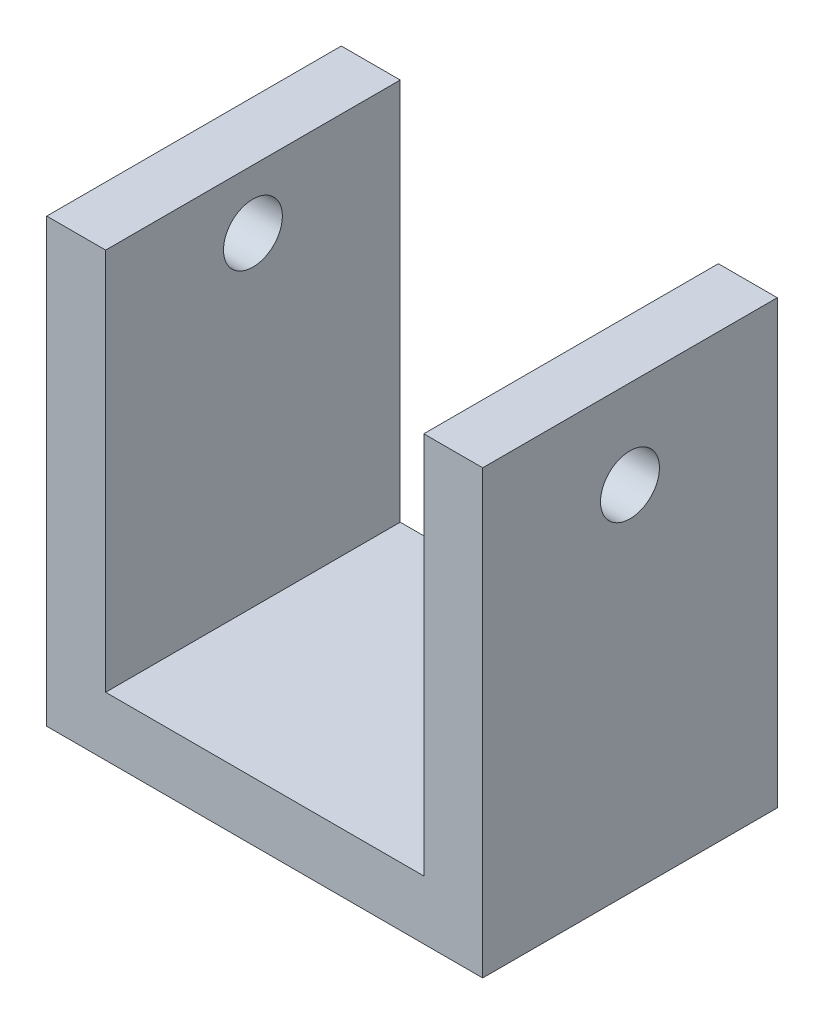
ISO-10303-21;
HEADER;
FILE_DESCRIPTION(('STEP AP214'),'2;1');
FILE_NAME('part.step','',(''),(''),'','','');
FILE_SCHEMA(('AUTOMOTIVE_DESIGN { 1 0 10303 214 1 1 1 1 }'));
ENDSEC;
DATA;
#1=APPLICATION_CONTEXT('core data for automotive mechanical design processes');
#2=APPLICATION_PROTOCOL_DEFINITION('international standard','automotive_design',2000,#1);
#3=PRODUCT_CONTEXT('',#1,'mechanical');
#4=PRODUCT('Part','Part','',(#3));
#5=PRODUCT_RELATED_PRODUCT_CATEGORY('part','',(#4));
#6=PRODUCT_DEFINITION_FORMATION('','',#4);
#7=PRODUCT_DEFINITION_CONTEXT('part definition',#1,'design');
#8=PRODUCT_DEFINITION('design','',#6,#7);
#9=PRODUCT_DEFINITION_SHAPE('','',#8);
#10=(LENGTH_UNIT() NAMED_UNIT(*) SI_UNIT(.MILLI.,.METRE.));
#11=(NAMED_UNIT(*) PLANE_ANGLE_UNIT() SI_UNIT($,.RADIAN.));
#12=(NAMED_UNIT(*) SI_UNIT($,.STERADIAN.) SOLID_ANGLE_UNIT());
#13=UNCERTAINTY_MEASURE_WITH_UNIT(LENGTH_MEASURE(1.E-05),#10,'distance_accuracy_value','');
#14=(GEOMETRIC_REPRESENTATION_CONTEXT(3) GLOBAL_UNCERTAINTY_ASSIGNED_CONTEXT((#13)) GLOBAL_UNIT_ASSIGNED_CONTEXT((#10,
#11,#12)) REPRESENTATION_CONTEXT('',''));
#15=CARTESIAN_POINT('',(0.,0.,0.));
#16=DIRECTION('',(0.,0.,1.));
#17=DIRECTION('',(1.,0.,0.));
#18=AXIS2_PLACEMENT_3D('',#15,#16,#17);
#19=CARTESIAN_POINT('',(0.,10.,0.));
#20=DIRECTION('',(0.,1.,0.));
#21=DIRECTION('',(0.,0.,1.));
#22=AXIS2_PLACEMENT_3D('',#19,#20,#21);
#23=PLANE('',#22);
#24=DIRECTION('',(1.,0.,0.));
#25=VECTOR('',#24,1.);
#26=CARTESIAN_POINT('',(37.,10.,25.));
#27=LINE('',#26,#25);
#28=CARTESIAN_POINT('',(-27.,10.,25.));
#29=VERTEX_POINT('',#28);
#30=CARTESIAN_POINT('',(27.,10.,25.));
#31=VERTEX_POINT('',#30);
#32=EDGE_CURVE('E58',#29,#31,#27,.T.);
#33=ORIENTED_EDGE('',*,*,#32,.T.);
#34=DIRECTION('',(0.,0.,1.));
#35=VECTOR('',#34,1.);
#36=CARTESIAN_POINT('',(27.,10.,-25.));
#37=LINE('',#36,#35);
#38=CARTESIAN_POINT('',(27.,10.,-25.));
#39=VERTEX_POINT('',#38);
#40=EDGE_CURVE('E53',#39,#31,#37,.T.);
#41=ORIENTED_EDGE('',*,*,#40,.F.);
#42=DIRECTION('',(-1.,0.,0.));
#43=VECTOR('',#42,1.);
#44=CARTESIAN_POINT('',(37.,10.,-25.));
#45=LINE('',#44,#43);
#46=CARTESIAN_POINT('',(-27.,10.,-25.));
#47=VERTEX_POINT('',#46);
#48=EDGE_CURVE('E39',#39,#47,#45,.T.);
#49=ORIENTED_EDGE('',*,*,#48,.T.);
#50=DIRECTION('',(0.,0.,-1.));
#51=VECTOR('',#50,1.);
#52=CARTESIAN_POINT('',(-27.,10.,-25.));
#53=LINE('',#52,#51);
#54=EDGE_CURVE('E138',#29,#47,#53,.T.);
#55=ORIENTED_EDGE('',*,*,#54,.F.);
#56=EDGE_LOOP('',(#33,#41,#49,#55));
#57=FACE_BOUND('',#56,.T.);
#58=ADVANCED_FACE('F35',(#57),#23,.T.);
#59=CARTESIAN_POINT('',(-37.,10.,25.));
#60=DIRECTION('',(1.,0.,0.));
#61=DIRECTION('',(0.,0.,-1.));
#62=AXIS2_PLACEMENT_3D('',#59,#60,#61);
#63=PLANE('',#62);
#64=CARTESIAN_POINT('',(-37.,65.,0.));
#65=DIRECTION('',(1.,0.,0.));
#66=DIRECTION('',(0.,0.,-1.));
#67=AXIS2_PLACEMENT_3D('',#64,#65,#66);
#68=CIRCLE('',#67,5.);
#69=CARTESIAN_POINT('',(-37.,65.,-5.));
#70=VERTEX_POINT('',#69);
#71=EDGE_CURVE('E127',#70,#70,#68,.T.);
#72=ORIENTED_EDGE('',*,*,#71,.T.);
#73=EDGE_LOOP('',(#72));
#74=FACE_BOUND('',#73,.T.);
#75=DIRECTION('',(0.,0.,1.));
#76=VECTOR('',#75,1.);
#77=CARTESIAN_POINT('',(-37.,0.,25.));
#78=LINE('',#77,#76);
#79=CARTESIAN_POINT('',(-37.,0.,-25.));
#80=VERTEX_POINT('',#79);
#81=CARTESIAN_POINT('',(-37.,0.,25.));
#82=VERTEX_POINT('',#81);
#83=EDGE_CURVE('E163',#80,#82,#78,.T.);
#84=ORIENTED_EDGE('',*,*,#83,.T.);
#85=DIRECTION('',(0.,-1.,0.));
#86=VECTOR('',#85,1.);
#87=CARTESIAN_POINT('',(-37.,10.,25.));
#88=LINE('',#87,#86);
#89=CARTESIAN_POINT('',(-37.,75.,25.));
#90=VERTEX_POINT('',#89);
#91=EDGE_CURVE('E11',#90,#82,#88,.T.);
#92=ORIENTED_EDGE('',*,*,#91,.F.);
#93=DIRECTION('',(0.,0.,1.));
#94=VECTOR('',#93,1.);
#95=CARTESIAN_POINT('',(-37.,75.,-25.));
#96=LINE('',#95,#94);
#97=CARTESIAN_POINT('',(-37.,75.,-25.));
#98=VERTEX_POINT('',#97);
#99=EDGE_CURVE('E139',#98,#90,#96,.T.);
#100=ORIENTED_EDGE('',*,*,#99,.F.);
#101=DIRECTION('',(0.,-1.,0.));
#102=VECTOR('',#101,1.);
#103=CARTESIAN_POINT('',(-37.,10.,-25.));
#104=LINE('',#103,#102);
#105=EDGE_CURVE('E111',#98,#80,#104,.T.);
#106=ORIENTED_EDGE('',*,*,#105,.T.);
#107=EDGE_LOOP('',(#84,#92,#100,#106));
#108=FACE_BOUND('',#107,.T.);
#109=ADVANCED_FACE('F37',(#74,#108),#63,.F.);
#110=CARTESIAN_POINT('',(37.,10.,25.));
#111=DIRECTION('',(0.,0.,-1.));
#112=DIRECTION('',(-1.,0.,0.));
#113=AXIS2_PLACEMENT_3D('',#110,#111,#112);
#114=PLANE('',#113);
#115=DIRECTION('',(1.,0.,0.));
#116=VECTOR('',#115,1.);
#117=CARTESIAN_POINT('',(37.,0.,25.));
#118=LINE('',#117,#116);
#119=CARTESIAN_POINT('',(37.,0.,25.));
#120=VERTEX_POINT('',#119);
#121=EDGE_CURVE('E169',#82,#120,#118,.T.);
#122=ORIENTED_EDGE('',*,*,#121,.T.);
#123=DIRECTION('',(0.,-1.,0.));
#124=VECTOR('',#123,1.);
#125=CARTESIAN_POINT('',(37.,10.,25.));
#126=LINE('',#125,#124);
#127=CARTESIAN_POINT('',(37.,75.,25.));
#128=VERTEX_POINT('',#127);
#129=EDGE_CURVE('E45',#128,#120,#126,.T.);
#130=ORIENTED_EDGE('',*,*,#129,.F.);
#131=DIRECTION('',(1.,0.,0.));
#132=VECTOR('',#131,1.);
#133=CARTESIAN_POINT('',(37.,75.,25.));
#134=LINE('',#133,#132);
#135=CARTESIAN_POINT('',(27.,75.,25.));
#136=VERTEX_POINT('',#135);
#137=EDGE_CURVE('E125',#136,#128,#134,.T.);
#138=ORIENTED_EDGE('',*,*,#137,.F.);
#139=DIRECTION('',(0.,-1.,0.));
#140=VECTOR('',#139,1.);
#141=CARTESIAN_POINT('',(27.,75.,25.));
#142=LINE('',#141,#140);
#143=EDGE_CURVE('E133',#136,#31,#142,.T.);
#144=ORIENTED_EDGE('',*,*,#143,.T.);
#145=ORIENTED_EDGE('',*,*,#32,.F.);
#146=DIRECTION('',(0.,-1.,0.));
#147=VECTOR('',#146,1.);
#148=CARTESIAN_POINT('',(-27.,75.,25.));
#149=LINE('',#148,#147);
#150=CARTESIAN_POINT('',(-27.,75.,25.));
#151=VERTEX_POINT('',#150);
#152=EDGE_CURVE('E159',#151,#29,#149,.T.);
#153=ORIENTED_EDGE('',*,*,#152,.F.);
#154=DIRECTION('',(1.,0.,0.));
#155=VECTOR('',#154,1.);
#156=CARTESIAN_POINT('',(-37.,75.,25.));
#157=LINE('',#156,#155);
#158=EDGE_CURVE('E142',#90,#151,#157,.T.);
#159=ORIENTED_EDGE('',*,*,#158,.F.);
#160=ORIENTED_EDGE('',*,*,#91,.T.);
#161=EDGE_LOOP('',(#122,#130,#138,#144,#145,#153,#159,#160));
#162=FACE_BOUND('',#161,.T.);
#163=ADVANCED_FACE('F191',(#162),#114,.F.);
#164=CARTESIAN_POINT('',(37.,10.,25.));
#165=DIRECTION('',(-1.,0.,0.));
#166=DIRECTION('',(0.,0.,1.));
#167=AXIS2_PLACEMENT_3D('',#164,#165,#166);
#168=PLANE('',#167);
#169=CARTESIAN_POINT('',(37.,60.,0.));
#170=DIRECTION('',(-1.,0.,0.));
#171=DIRECTION('',(0.,0.,1.));
#172=AXIS2_PLACEMENT_3D('',#169,#170,#171);
#173=CIRCLE('',#172,5.00000000000001);
#174=CARTESIAN_POINT('',(37.,60.,5.));
#175=VERTEX_POINT('',#174);
#176=EDGE_CURVE('E321',#175,#175,#173,.T.);
#177=ORIENTED_EDGE('',*,*,#176,.T.);
#178=EDGE_LOOP('',(#177));
#179=FACE_BOUND('',#178,.T.);
#180=DIRECTION('',(0.,0.,-1.));
#181=VECTOR('',#180,1.);
#182=CARTESIAN_POINT('',(37.,0.,25.));
#183=LINE('',#182,#181);
#184=CARTESIAN_POINT('',(37.,0.,-25.));
#185=VERTEX_POINT('',#184);
#186=EDGE_CURVE('E108',#120,#185,#183,.T.);
#187=ORIENTED_EDGE('',*,*,#186,.T.);
#188=DIRECTION('',(0.,-1.,0.));
#189=VECTOR('',#188,1.);
#190=CARTESIAN_POINT('',(37.,10.,-25.));
#191=LINE('',#190,#189);
#192=CARTESIAN_POINT('',(37.,75.,-25.));
#193=VERTEX_POINT('',#192);
#194=EDGE_CURVE('E101',#193,#185,#191,.T.);
#195=ORIENTED_EDGE('',*,*,#194,.F.);
#196=DIRECTION('',(0.,0.,-1.));
#197=VECTOR('',#196,1.);
#198=CARTESIAN_POINT('',(37.,75.,-25.));
#199=LINE('',#198,#197);
#200=EDGE_CURVE('E106',#128,#193,#199,.T.);
#201=ORIENTED_EDGE('',*,*,#200,.F.);
#202=ORIENTED_EDGE('',*,*,#129,.T.);
#203=EDGE_LOOP('',(#187,#195,#201,#202));
#204=FACE_BOUND('',#203,.T.);
#205=ADVANCED_FACE('F103',(#179,#204),#168,.F.);
#206=CARTESIAN_POINT('',(37.,10.,-25.));
#207=DIRECTION('',(0.,0.,1.));
#208=DIRECTION('',(1.,0.,0.));
#209=AXIS2_PLACEMENT_3D('',#206,#207,#208);
#210=PLANE('',#209);
#211=DIRECTION('',(-1.,0.,0.));
#212=VECTOR('',#211,1.);
#213=CARTESIAN_POINT('',(37.,0.,-25.));
#214=LINE('',#213,#212);
#215=EDGE_CURVE('E178',#185,#80,#214,.T.);
#216=ORIENTED_EDGE('',*,*,#215,.T.);
#217=ORIENTED_EDGE('',*,*,#105,.F.);
#218=DIRECTION('',(-1.,0.,0.));
#219=VECTOR('',#218,1.);
#220=CARTESIAN_POINT('',(-37.,75.,-25.));
#221=LINE('',#220,#219);
#222=CARTESIAN_POINT('',(-27.,75.,-25.));
#223=VERTEX_POINT('',#222);
#224=EDGE_CURVE('E146',#223,#98,#221,.T.);
#225=ORIENTED_EDGE('',*,*,#224,.F.);
#226=DIRECTION('',(0.,-1.,0.));
#227=VECTOR('',#226,1.);
#228=CARTESIAN_POINT('',(-27.,75.,-25.));
#229=LINE('',#228,#227);
#230=EDGE_CURVE('E149',#223,#47,#229,.T.);
#231=ORIENTED_EDGE('',*,*,#230,.T.);
#232=ORIENTED_EDGE('',*,*,#48,.F.);
#233=DIRECTION('',(0.,-1.,0.));
#234=VECTOR('',#233,1.);
#235=CARTESIAN_POINT('',(27.,75.,-25.));
#236=LINE('',#235,#234);
#237=CARTESIAN_POINT('',(27.,75.,-25.));
#238=VERTEX_POINT('',#237);
#239=EDGE_CURVE('E117',#238,#39,#236,.T.);
#240=ORIENTED_EDGE('',*,*,#239,.F.);
#241=DIRECTION('',(-1.,0.,0.));
#242=VECTOR('',#241,1.);
#243=CARTESIAN_POINT('',(37.,75.,-25.));
#244=LINE('',#243,#242);
#245=EDGE_CURVE('E114',#193,#238,#244,.T.);
#246=ORIENTED_EDGE('',*,*,#245,.F.);
#247=ORIENTED_EDGE('',*,*,#194,.T.);
#248=EDGE_LOOP('',(#216,#217,#225,#231,#232,#240,#246,#247));
#249=FACE_BOUND('',#248,.T.);
#250=ADVANCED_FACE('F115',(#249),#210,.F.);
#251=CARTESIAN_POINT('',(0.,0.,0.));
#252=DIRECTION('',(0.,1.,0.));
#253=DIRECTION('',(0.,0.,1.));
#254=AXIS2_PLACEMENT_3D('',#251,#252,#253);
#255=PLANE('',#254);
#256=ORIENTED_EDGE('',*,*,#83,.F.);
#257=ORIENTED_EDGE('',*,*,#215,.F.);
#258=ORIENTED_EDGE('',*,*,#186,.F.);
#259=ORIENTED_EDGE('',*,*,#121,.F.);
#260=EDGE_LOOP('',(#256,#257,#258,#259));
#261=FACE_BOUND('',#260,.T.);
#262=ADVANCED_FACE('F183',(#261),#255,.F.);
#263=CARTESIAN_POINT('',(-27.,75.,-25.));
#264=DIRECTION('',(-1.,0.,0.));
#265=DIRECTION('',(0.,0.,1.));
#266=AXIS2_PLACEMENT_3D('',#263,#264,#265);
#267=PLANE('',#266);
#268=CARTESIAN_POINT('',(-27.,65.,0.));
#269=DIRECTION('',(1.,0.,0.));
#270=DIRECTION('',(0.,0.,-1.));
#271=AXIS2_PLACEMENT_3D('',#268,#269,#270);
#272=CIRCLE('',#271,5.);
#273=CARTESIAN_POINT('',(-27.,65.,-5.));
#274=VERTEX_POINT('',#273);
#275=EDGE_CURVE('E322',#274,#274,#272,.T.);
#276=ORIENTED_EDGE('',*,*,#275,.F.);
#277=EDGE_LOOP('',(#276));
#278=FACE_BOUND('',#277,.T.);
#279=ORIENTED_EDGE('',*,*,#54,.T.);
#280=ORIENTED_EDGE('',*,*,#230,.F.);
#281=DIRECTION('',(0.,0.,-1.));
#282=VECTOR('',#281,1.);
#283=CARTESIAN_POINT('',(-27.,75.,-25.));
#284=LINE('',#283,#282);
#285=EDGE_CURVE('E144',#151,#223,#284,.T.);
#286=ORIENTED_EDGE('',*,*,#285,.F.);
#287=ORIENTED_EDGE('',*,*,#152,.T.);
#288=EDGE_LOOP('',(#279,#280,#286,#287));
#289=FACE_BOUND('',#288,.T.);
#290=ADVANCED_FACE('F190',(#278,#289),#267,.F.);
#291=CARTESIAN_POINT('',(0.,75.,0.));
#292=DIRECTION('',(0.,1.,0.));
#293=DIRECTION('',(0.,0.,1.));
#294=AXIS2_PLACEMENT_3D('',#291,#292,#293);
#295=PLANE('',#294);
#296=ORIENTED_EDGE('',*,*,#99,.T.);
#297=ORIENTED_EDGE('',*,*,#158,.T.);
#298=ORIENTED_EDGE('',*,*,#285,.T.);
#299=ORIENTED_EDGE('',*,*,#224,.T.);
#300=EDGE_LOOP('',(#296,#297,#298,#299));
#301=FACE_BOUND('',#300,.T.);
#302=ADVANCED_FACE('F188',(#301),#295,.T.);
#303=CARTESIAN_POINT('',(27.,75.,-25.));
#304=DIRECTION('',(1.,0.,0.));
#305=DIRECTION('',(0.,0.,-1.));
#306=AXIS2_PLACEMENT_3D('',#303,#304,#305);
#307=PLANE('',#306);
#308=CARTESIAN_POINT('',(27.,60.,0.));
#309=DIRECTION('',(-1.,0.,0.));
#310=DIRECTION('',(0.,0.,1.));
#311=AXIS2_PLACEMENT_3D('',#308,#309,#310);
#312=CIRCLE('',#311,5.00000000000001);
#313=CARTESIAN_POINT('',(27.,60.,5.));
#314=VERTEX_POINT('',#313);
#315=EDGE_CURVE('E318',#314,#314,#312,.T.);
#316=ORIENTED_EDGE('',*,*,#315,.F.);
#317=EDGE_LOOP('',(#316));
#318=FACE_BOUND('',#317,.T.);
#319=ORIENTED_EDGE('',*,*,#40,.T.);
#320=ORIENTED_EDGE('',*,*,#143,.F.);
#321=DIRECTION('',(0.,0.,1.));
#322=VECTOR('',#321,1.);
#323=CARTESIAN_POINT('',(27.,75.,-25.));
#324=LINE('',#323,#322);
#325=EDGE_CURVE('E120',#238,#136,#324,.T.);
#326=ORIENTED_EDGE('',*,*,#325,.F.);
#327=ORIENTED_EDGE('',*,*,#239,.T.);
#328=EDGE_LOOP('',(#319,#320,#326,#327));
#329=FACE_BOUND('',#328,.T.);
#330=ADVANCED_FACE('F194',(#318,#329),#307,.F.);
#331=CARTESIAN_POINT('',(0.,75.,0.));
#332=DIRECTION('',(0.,-1.,0.));
#333=DIRECTION('',(0.,0.,-1.));
#334=AXIS2_PLACEMENT_3D('',#331,#332,#333);
#335=PLANE('',#334);
#336=ORIENTED_EDGE('',*,*,#200,.T.);
#337=ORIENTED_EDGE('',*,*,#245,.T.);
#338=ORIENTED_EDGE('',*,*,#325,.T.);
#339=ORIENTED_EDGE('',*,*,#137,.T.);
#340=EDGE_LOOP('',(#336,#337,#338,#339));
#341=FACE_BOUND('',#340,.T.);
#342=ADVANCED_FACE('F123',(#341),#335,.F.);
#343=CARTESIAN_POINT('',(-87.,65.,0.));
#344=DIRECTION('',(1.,0.,0.));
#345=DIRECTION('',(0.,0.,-1.));
#346=AXIS2_PLACEMENT_3D('',#343,#344,#345);
#347=CYLINDRICAL_SURFACE('',#346,5.);
#348=ORIENTED_EDGE('',*,*,#275,.T.);
#349=EDGE_LOOP('',(#348));
#350=FACE_BOUND('',#349,.T.);
#351=ORIENTED_EDGE('',*,*,#71,.F.);
#352=EDGE_LOOP('',(#351));
#353=FACE_BOUND('',#352,.T.);
#354=ADVANCED_FACE('F202',(#350,#353),#347,.F.);
#355=CARTESIAN_POINT('',(87.,60.,0.));
#356=DIRECTION('',(-1.,0.,0.));
#357=DIRECTION('',(0.,0.,1.));
#358=AXIS2_PLACEMENT_3D('',#355,#356,#357);
#359=CYLINDRICAL_SURFACE('',#358,5.00000000000001);
#360=ORIENTED_EDGE('',*,*,#315,.T.);
#361=EDGE_LOOP('',(#360));
#362=FACE_BOUND('',#361,.T.);
#363=ORIENTED_EDGE('',*,*,#176,.F.);
#364=EDGE_LOOP('',(#363));
#365=FACE_BOUND('',#364,.T.);
#366=ADVANCED_FACE('F299',(#362,#365),#359,.F.);
#367=CLOSED_SHELL('',(#58,#109,#163,#205,#250,#262,#290,#302,#330,#342,#354,#366));
#368=MANIFOLD_SOLID_BREP('B2',#367);
#369=ADVANCED_BREP_SHAPE_REPRESENTATION('',(#18,#368),#14);
#370=SHAPE_DEFINITION_REPRESENTATION(#9,#369);
ENDSEC;
END-ISO-10303-21;
